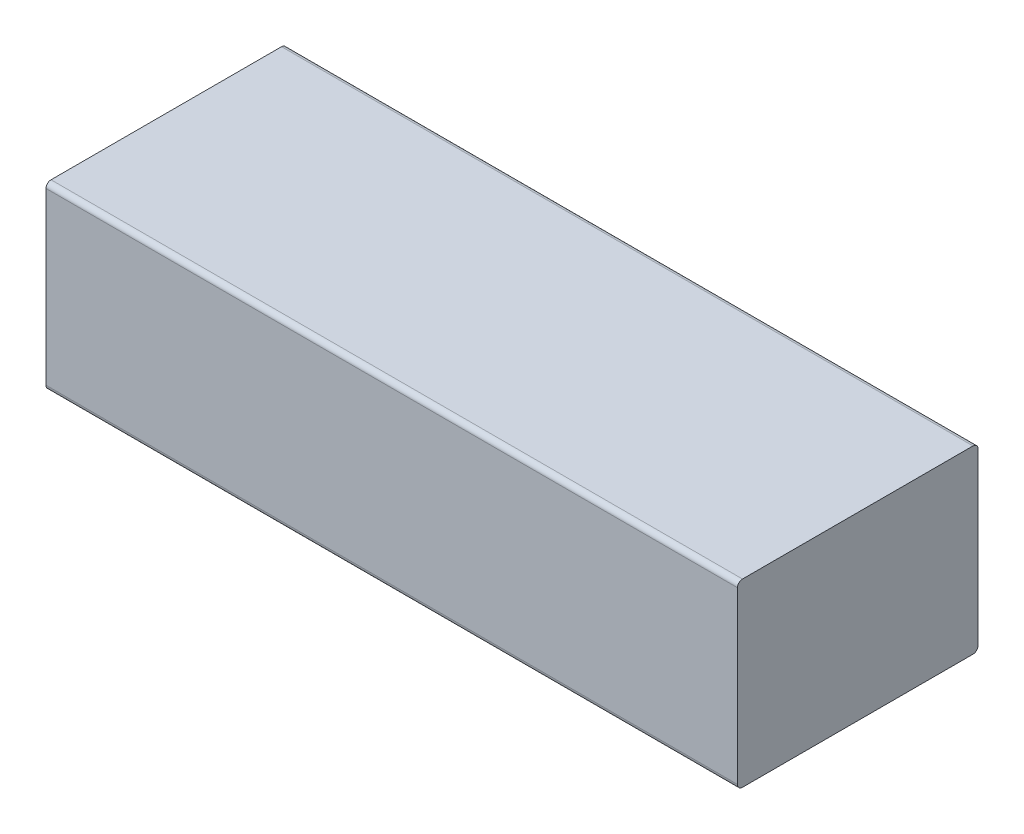
ISO-10303-21;
HEADER;
FILE_DESCRIPTION(('STEP AP214'),'2;1');
FILE_NAME('part.step','',(''),(''),'','','');
FILE_SCHEMA(('AUTOMOTIVE_DESIGN { 1 0 10303 214 1 1 1 1 }'));
ENDSEC;
DATA;
#1=APPLICATION_CONTEXT('core data for automotive mechanical design processes');
#2=APPLICATION_PROTOCOL_DEFINITION('international standard','automotive_design',2000,#1);
#3=PRODUCT_CONTEXT('',#1,'mechanical');
#4=PRODUCT('Part','Part','',(#3));
#5=PRODUCT_RELATED_PRODUCT_CATEGORY('part','',(#4));
#6=PRODUCT_DEFINITION_FORMATION('','',#4);
#7=PRODUCT_DEFINITION_CONTEXT('part definition',#1,'design');
#8=PRODUCT_DEFINITION('design','',#6,#7);
#9=PRODUCT_DEFINITION_SHAPE('','',#8);
#10=(LENGTH_UNIT() NAMED_UNIT(*) SI_UNIT(.MILLI.,.METRE.));
#11=(NAMED_UNIT(*) PLANE_ANGLE_UNIT() SI_UNIT($,.RADIAN.));
#12=(NAMED_UNIT(*) SI_UNIT($,.STERADIAN.) SOLID_ANGLE_UNIT());
#13=UNCERTAINTY_MEASURE_WITH_UNIT(LENGTH_MEASURE(1.E-05),#10,'distance_accuracy_value','');
#14=(GEOMETRIC_REPRESENTATION_CONTEXT(3) GLOBAL_UNCERTAINTY_ASSIGNED_CONTEXT((#13)) GLOBAL_UNIT_ASSIGNED_CONTEXT((#10,
#11,#12)) REPRESENTATION_CONTEXT('',''));
#15=CARTESIAN_POINT('',(0.,0.,0.));
#16=DIRECTION('',(0.,0.,1.));
#17=DIRECTION('',(1.,0.,0.));
#18=AXIS2_PLACEMENT_3D('',#15,#16,#17);
#19=CARTESIAN_POINT('',(0.,0.,-48.));
#20=DIRECTION('',(-1.,0.,0.));
#21=DIRECTION('',(0.,0.,1.));
#22=AXIS2_PLACEMENT_3D('',#19,#20,#21);
#23=PLANE('',#22);
#24=DIRECTION('',(0.,-1.,0.));
#25=VECTOR('',#24,1.);
#26=CARTESIAN_POINT('',(0.,4.,-3.37357315779463));
#27=LINE('',#26,#25);
#28=CARTESIAN_POINT('',(0.,4.,-3.37357315779463));
#29=VERTEX_POINT('',#28);
#30=CARTESIAN_POINT('',(0.,0.,-3.37357315779463));
#31=VERTEX_POINT('',#30);
#32=EDGE_CURVE('E170',#29,#31,#27,.T.);
#33=ORIENTED_EDGE('',*,*,#32,.T.);
#34=DIRECTION('',(0.,0.,1.));
#35=VECTOR('',#34,1.);
#36=CARTESIAN_POINT('',(0.,0.,-48.));
#37=LINE('',#36,#35);
#38=CARTESIAN_POINT('',(0.,0.,-1.));
#39=VERTEX_POINT('',#38);
#40=EDGE_CURVE('E166',#31,#39,#37,.T.);
#41=ORIENTED_EDGE('',*,*,#40,.T.);
#42=CARTESIAN_POINT('',(0.,1.,-1.));
#43=DIRECTION('',(-1.,0.,0.));
#44=DIRECTION('',(0.,0.,1.));
#45=AXIS2_PLACEMENT_3D('',#42,#43,#44);
#46=CIRCLE('',#45,1.);
#47=CARTESIAN_POINT('',(0.,1.,0.));
#48=VERTEX_POINT('',#47);
#49=EDGE_CURVE('E203',#39,#48,#46,.T.);
#50=ORIENTED_EDGE('',*,*,#49,.T.);
#51=DIRECTION('',(0.,-1.,0.));
#52=VECTOR('',#51,1.);
#53=CARTESIAN_POINT('',(0.,0.,0.));
#54=LINE('',#53,#52);
#55=CARTESIAN_POINT('',(0.,35.,0.));
#56=VERTEX_POINT('',#55);
#57=EDGE_CURVE('E167',#56,#48,#54,.T.);
#58=ORIENTED_EDGE('',*,*,#57,.F.);
#59=CARTESIAN_POINT('',(0.,35.,-1.));
#60=DIRECTION('',(-1.,0.,0.));
#61=DIRECTION('',(0.,0.,1.));
#62=AXIS2_PLACEMENT_3D('',#59,#60,#61);
#63=CIRCLE('',#62,1.);
#64=CARTESIAN_POINT('',(0.,36.,-1.));
#65=VERTEX_POINT('',#64);
#66=EDGE_CURVE('E66',#56,#65,#63,.T.);
#67=ORIENTED_EDGE('',*,*,#66,.T.);
#68=DIRECTION('',(0.,0.,1.));
#69=VECTOR('',#68,1.);
#70=CARTESIAN_POINT('',(0.,36.,-48.));
#71=LINE('',#70,#69);
#72=CARTESIAN_POINT('',(0.,36.,-47.));
#73=VERTEX_POINT('',#72);
#74=EDGE_CURVE('E173',#73,#65,#71,.T.);
#75=ORIENTED_EDGE('',*,*,#74,.F.);
#76=CARTESIAN_POINT('',(0.,35.,-47.));
#77=DIRECTION('',(-1.,0.,0.));
#78=DIRECTION('',(0.,0.,1.));
#79=AXIS2_PLACEMENT_3D('',#76,#77,#78);
#80=CIRCLE('',#79,1.);
#81=CARTESIAN_POINT('',(0.,35.,-48.));
#82=VERTEX_POINT('',#81);
#83=EDGE_CURVE('E201',#73,#82,#80,.T.);
#84=ORIENTED_EDGE('',*,*,#83,.T.);
#85=DIRECTION('',(0.,-1.,0.));
#86=VECTOR('',#85,1.);
#87=CARTESIAN_POINT('',(0.,0.,-48.));
#88=LINE('',#87,#86);
#89=CARTESIAN_POINT('',(0.,1.,-48.));
#90=VERTEX_POINT('',#89);
#91=EDGE_CURVE('E159',#82,#90,#88,.T.);
#92=ORIENTED_EDGE('',*,*,#91,.T.);
#93=CARTESIAN_POINT('',(0.,1.,-47.));
#94=DIRECTION('',(-1.,0.,0.));
#95=DIRECTION('',(0.,0.,1.));
#96=AXIS2_PLACEMENT_3D('',#93,#94,#95);
#97=CIRCLE('',#96,1.);
#98=CARTESIAN_POINT('',(0.,0.,-47.));
#99=VERTEX_POINT('',#98);
#100=EDGE_CURVE('E205',#90,#99,#97,.T.);
#101=ORIENTED_EDGE('',*,*,#100,.T.);
#102=CARTESIAN_POINT('',(0.,0.,-13.1008128877053));
#103=VERTEX_POINT('',#102);
#104=EDGE_CURVE('E152',#99,#103,#37,.T.);
#105=ORIENTED_EDGE('',*,*,#104,.T.);
#106=DIRECTION('',(0.,-1.,0.));
#107=VECTOR('',#106,1.);
#108=CARTESIAN_POINT('',(0.,4.,-13.1008128877053));
#109=LINE('',#108,#107);
#110=CARTESIAN_POINT('',(0.,4.,-13.1008128877053));
#111=VERTEX_POINT('',#110);
#112=EDGE_CURVE('E58',#111,#103,#109,.T.);
#113=ORIENTED_EDGE('',*,*,#112,.F.);
#114=DIRECTION('',(0.,0.,-1.));
#115=VECTOR('',#114,1.);
#116=CARTESIAN_POINT('',(0.,4.,-3.37357315779463));
#117=LINE('',#116,#115);
#118=EDGE_CURVE('E140',#29,#111,#117,.T.);
#119=ORIENTED_EDGE('',*,*,#118,.F.);
#120=EDGE_LOOP('',(#33,#41,#50,#58,#67,#75,#84,#92,#101,#105,#113,#119));
#121=FACE_BOUND('',#120,.T.);
#122=ADVANCED_FACE('F43',(#121),#23,.T.);
#123=CARTESIAN_POINT('',(0.,36.,-48.));
#124=DIRECTION('',(0.,1.,0.));
#125=DIRECTION('',(0.,0.,1.));
#126=AXIS2_PLACEMENT_3D('',#123,#124,#125);
#127=PLANE('',#126);
#128=DIRECTION('',(0.,0.,1.));
#129=VECTOR('',#128,1.);
#130=CARTESIAN_POINT('',(138.,36.,-48.));
#131=LINE('',#130,#129);
#132=CARTESIAN_POINT('',(138.,36.,-47.));
#133=VERTEX_POINT('',#132);
#134=CARTESIAN_POINT('',(138.,36.,-1.));
#135=VERTEX_POINT('',#134);
#136=EDGE_CURVE('E176',#133,#135,#131,.T.);
#137=ORIENTED_EDGE('',*,*,#136,.F.);
#138=DIRECTION('',(-1.,0.,0.));
#139=VECTOR('',#138,1.);
#140=CARTESIAN_POINT('',(0.,36.,-47.));
#141=LINE('',#140,#139);
#142=EDGE_CURVE('E11',#133,#73,#141,.T.);
#143=ORIENTED_EDGE('',*,*,#142,.T.);
#144=ORIENTED_EDGE('',*,*,#74,.T.);
#145=DIRECTION('',(-1.,0.,0.));
#146=VECTOR('',#145,1.);
#147=CARTESIAN_POINT('',(138.,36.,-1.));
#148=LINE('',#147,#146);
#149=EDGE_CURVE('E51',#65,#135,#148,.F.);
#150=ORIENTED_EDGE('',*,*,#149,.T.);
#151=EDGE_LOOP('',(#137,#143,#144,#150));
#152=FACE_BOUND('',#151,.T.);
#153=ADVANCED_FACE('F215',(#152),#127,.T.);
#154=CARTESIAN_POINT('',(138.,0.,-48.));
#155=DIRECTION('',(1.,0.,0.));
#156=DIRECTION('',(0.,0.,-1.));
#157=AXIS2_PLACEMENT_3D('',#154,#155,#156);
#158=PLANE('',#157);
#159=DIRECTION('',(0.,0.,1.));
#160=VECTOR('',#159,1.);
#161=CARTESIAN_POINT('',(138.,0.,-48.));
#162=LINE('',#161,#160);
#163=CARTESIAN_POINT('',(138.,0.,-47.));
#164=VERTEX_POINT('',#163);
#165=CARTESIAN_POINT('',(138.,0.,-1.));
#166=VERTEX_POINT('',#165);
#167=EDGE_CURVE('E179',#164,#166,#162,.T.);
#168=ORIENTED_EDGE('',*,*,#167,.F.);
#169=CARTESIAN_POINT('',(138.,1.,-47.));
#170=DIRECTION('',(1.,0.,0.));
#171=DIRECTION('',(0.,0.,-1.));
#172=AXIS2_PLACEMENT_3D('',#169,#170,#171);
#173=CIRCLE('',#172,1.);
#174=CARTESIAN_POINT('',(138.,1.,-48.));
#175=VERTEX_POINT('',#174);
#176=EDGE_CURVE('E194',#164,#175,#173,.T.);
#177=ORIENTED_EDGE('',*,*,#176,.T.);
#178=DIRECTION('',(0.,1.,0.));
#179=VECTOR('',#178,1.);
#180=CARTESIAN_POINT('',(138.,0.,-48.));
#181=LINE('',#180,#179);
#182=CARTESIAN_POINT('',(138.,35.,-48.));
#183=VERTEX_POINT('',#182);
#184=EDGE_CURVE('E162',#175,#183,#181,.T.);
#185=ORIENTED_EDGE('',*,*,#184,.T.);
#186=CARTESIAN_POINT('',(138.,35.,-47.));
#187=DIRECTION('',(1.,0.,0.));
#188=DIRECTION('',(0.,0.,-1.));
#189=AXIS2_PLACEMENT_3D('',#186,#187,#188);
#190=CIRCLE('',#189,1.);
#191=EDGE_CURVE('E190',#183,#133,#190,.T.);
#192=ORIENTED_EDGE('',*,*,#191,.T.);
#193=ORIENTED_EDGE('',*,*,#136,.T.);
#194=CARTESIAN_POINT('',(138.,35.,-1.));
#195=DIRECTION('',(1.,0.,0.));
#196=DIRECTION('',(0.,0.,-1.));
#197=AXIS2_PLACEMENT_3D('',#194,#195,#196);
#198=CIRCLE('',#197,1.);
#199=CARTESIAN_POINT('',(138.,35.,0.));
#200=VERTEX_POINT('',#199);
#201=EDGE_CURVE('E188',#135,#200,#198,.T.);
#202=ORIENTED_EDGE('',*,*,#201,.T.);
#203=DIRECTION('',(0.,1.,0.));
#204=VECTOR('',#203,1.);
#205=CARTESIAN_POINT('',(138.,0.,0.));
#206=LINE('',#205,#204);
#207=CARTESIAN_POINT('',(138.,1.,0.));
#208=VERTEX_POINT('',#207);
#209=EDGE_CURVE('E163',#208,#200,#206,.T.);
#210=ORIENTED_EDGE('',*,*,#209,.F.);
#211=CARTESIAN_POINT('',(138.,1.,-1.));
#212=DIRECTION('',(1.,0.,0.));
#213=DIRECTION('',(0.,0.,-1.));
#214=AXIS2_PLACEMENT_3D('',#211,#212,#213);
#215=CIRCLE('',#214,1.);
#216=EDGE_CURVE('E192',#208,#166,#215,.T.);
#217=ORIENTED_EDGE('',*,*,#216,.T.);
#218=EDGE_LOOP('',(#168,#177,#185,#192,#193,#202,#210,#217));
#219=FACE_BOUND('',#218,.T.);
#220=ADVANCED_FACE('F221',(#219),#158,.T.);
#221=CARTESIAN_POINT('',(0.,0.,-48.));
#222=DIRECTION('',(0.,-1.,0.));
#223=DIRECTION('',(0.,0.,-1.));
#224=AXIS2_PLACEMENT_3D('',#221,#222,#223);
#225=PLANE('',#224);
#226=DIRECTION('',(-1.,0.,0.));
#227=VECTOR('',#226,1.);
#228=CARTESIAN_POINT('',(0.,0.,-3.37357315779463));
#229=LINE('',#228,#227);
#230=CARTESIAN_POINT('',(5.12111463749805,0.,-3.37357315779463));
#231=VERTEX_POINT('',#230);
#232=EDGE_CURVE('E148',#231,#31,#229,.T.);
#233=ORIENTED_EDGE('',*,*,#232,.F.);
#234=DIRECTION('',(0.,0.,1.));
#235=VECTOR('',#234,1.);
#236=CARTESIAN_POINT('',(5.12111463749805,0.,-3.37357315779463));
#237=LINE('',#236,#235);
#238=CARTESIAN_POINT('',(5.12111463749805,0.,-13.1008128877053));
#239=VERTEX_POINT('',#238);
#240=EDGE_CURVE('E364',#239,#231,#237,.T.);
#241=ORIENTED_EDGE('',*,*,#240,.F.);
#242=DIRECTION('',(1.,0.,0.));
#243=VECTOR('',#242,1.);
#244=CARTESIAN_POINT('',(0.,0.,-13.1008128877053));
#245=LINE('',#244,#243);
#246=EDGE_CURVE('E365',#103,#239,#245,.T.);
#247=ORIENTED_EDGE('',*,*,#246,.F.);
#248=ORIENTED_EDGE('',*,*,#104,.F.);
#249=DIRECTION('',(1.,0.,0.));
#250=VECTOR('',#249,1.);
#251=CARTESIAN_POINT('',(0.,0.,-47.));
#252=LINE('',#251,#250);
#253=EDGE_CURVE('E185',#99,#164,#252,.T.);
#254=ORIENTED_EDGE('',*,*,#253,.T.);
#255=ORIENTED_EDGE('',*,*,#167,.T.);
#256=DIRECTION('',(1.,0.,0.));
#257=VECTOR('',#256,1.);
#258=CARTESIAN_POINT('',(0.,0.,-1.));
#259=LINE('',#258,#257);
#260=EDGE_CURVE('E175',#166,#39,#259,.F.);
#261=ORIENTED_EDGE('',*,*,#260,.T.);
#262=ORIENTED_EDGE('',*,*,#40,.F.);
#263=EDGE_LOOP('',(#233,#241,#247,#248,#254,#255,#261,#262));
#264=FACE_BOUND('',#263,.T.);
#265=ADVANCED_FACE('F235',(#264),#225,.T.);
#266=CARTESIAN_POINT('',(0.,0.,-48.));
#267=DIRECTION('',(0.,0.,-1.));
#268=DIRECTION('',(-1.,0.,0.));
#269=AXIS2_PLACEMENT_3D('',#266,#267,#268);
#270=PLANE('',#269);
#271=ORIENTED_EDGE('',*,*,#184,.F.);
#272=DIRECTION('',(1.,0.,0.));
#273=VECTOR('',#272,1.);
#274=CARTESIAN_POINT('',(0.,1.,-48.));
#275=LINE('',#274,#273);
#276=EDGE_CURVE('E198',#175,#90,#275,.F.);
#277=ORIENTED_EDGE('',*,*,#276,.T.);
#278=ORIENTED_EDGE('',*,*,#91,.F.);
#279=DIRECTION('',(-1.,0.,0.));
#280=VECTOR('',#279,1.);
#281=CARTESIAN_POINT('',(0.,35.,-48.));
#282=LINE('',#281,#280);
#283=EDGE_CURVE('E196',#82,#183,#282,.F.);
#284=ORIENTED_EDGE('',*,*,#283,.T.);
#285=EDGE_LOOP('',(#271,#277,#278,#284));
#286=FACE_BOUND('',#285,.T.);
#287=ADVANCED_FACE('F243',(#286),#270,.T.);
#288=CARTESIAN_POINT('',(0.,0.,0.));
#289=DIRECTION('',(0.,0.,-1.));
#290=DIRECTION('',(-1.,0.,0.));
#291=AXIS2_PLACEMENT_3D('',#288,#289,#290);
#292=PLANE('',#291);
#293=ORIENTED_EDGE('',*,*,#57,.T.);
#294=DIRECTION('',(1.,0.,0.));
#295=VECTOR('',#294,1.);
#296=CARTESIAN_POINT('',(138.,1.,0.));
#297=LINE('',#296,#295);
#298=EDGE_CURVE('E210',#48,#208,#297,.T.);
#299=ORIENTED_EDGE('',*,*,#298,.T.);
#300=ORIENTED_EDGE('',*,*,#209,.T.);
#301=DIRECTION('',(-1.,0.,0.));
#302=VECTOR('',#301,1.);
#303=CARTESIAN_POINT('',(0.,35.,0.));
#304=LINE('',#303,#302);
#305=EDGE_CURVE('E207',#200,#56,#304,.T.);
#306=ORIENTED_EDGE('',*,*,#305,.T.);
#307=EDGE_LOOP('',(#293,#299,#300,#306));
#308=FACE_BOUND('',#307,.T.);
#309=ADVANCED_FACE('F226',(#308),#292,.F.);
#310=CARTESIAN_POINT('',(0.,1.,-47.));
#311=DIRECTION('',(1.,0.,0.));
#312=DIRECTION('',(0.,0.,-1.));
#313=AXIS2_PLACEMENT_3D('',#310,#311,#312);
#314=CYLINDRICAL_SURFACE('',#313,1.);
#315=ORIENTED_EDGE('',*,*,#100,.F.);
#316=ORIENTED_EDGE('',*,*,#276,.F.);
#317=ORIENTED_EDGE('',*,*,#176,.F.);
#318=ORIENTED_EDGE('',*,*,#253,.F.);
#319=EDGE_LOOP('',(#315,#316,#317,#318));
#320=FACE_BOUND('',#319,.T.);
#321=ADVANCED_FACE('F239',(#320),#314,.T.);
#322=CARTESIAN_POINT('',(0.,1.,-1.));
#323=DIRECTION('',(-1.,0.,0.));
#324=DIRECTION('',(0.,0.,1.));
#325=AXIS2_PLACEMENT_3D('',#322,#323,#324);
#326=CYLINDRICAL_SURFACE('',#325,1.);
#327=ORIENTED_EDGE('',*,*,#49,.F.);
#328=ORIENTED_EDGE('',*,*,#260,.F.);
#329=ORIENTED_EDGE('',*,*,#216,.F.);
#330=ORIENTED_EDGE('',*,*,#298,.F.);
#331=EDGE_LOOP('',(#327,#328,#329,#330));
#332=FACE_BOUND('',#331,.T.);
#333=ADVANCED_FACE('F232',(#332),#326,.T.);
#334=CARTESIAN_POINT('',(0.,35.,-47.));
#335=DIRECTION('',(-1.,0.,0.));
#336=DIRECTION('',(0.,0.,1.));
#337=AXIS2_PLACEMENT_3D('',#334,#335,#336);
#338=CYLINDRICAL_SURFACE('',#337,1.);
#339=ORIENTED_EDGE('',*,*,#191,.F.);
#340=ORIENTED_EDGE('',*,*,#283,.F.);
#341=ORIENTED_EDGE('',*,*,#83,.F.);
#342=ORIENTED_EDGE('',*,*,#142,.F.);
#343=EDGE_LOOP('',(#339,#340,#341,#342));
#344=FACE_BOUND('',#343,.T.);
#345=ADVANCED_FACE('F247',(#344),#338,.T.);
#346=CARTESIAN_POINT('',(0.,35.,-1.));
#347=DIRECTION('',(1.,0.,0.));
#348=DIRECTION('',(0.,0.,-1.));
#349=AXIS2_PLACEMENT_3D('',#346,#347,#348);
#350=CYLINDRICAL_SURFACE('',#349,1.);
#351=ORIENTED_EDGE('',*,*,#201,.F.);
#352=ORIENTED_EDGE('',*,*,#149,.F.);
#353=ORIENTED_EDGE('',*,*,#66,.F.);
#354=ORIENTED_EDGE('',*,*,#305,.F.);
#355=EDGE_LOOP('',(#351,#352,#353,#354));
#356=FACE_BOUND('',#355,.T.);
#357=ADVANCED_FACE('F45',(#356),#350,.T.);
#358=CARTESIAN_POINT('',(0.,4.,-3.37357315779463));
#359=DIRECTION('',(0.,0.,1.));
#360=DIRECTION('',(1.,0.,0.));
#361=AXIS2_PLACEMENT_3D('',#358,#359,#360);
#362=PLANE('',#361);
#363=ORIENTED_EDGE('',*,*,#232,.T.);
#364=ORIENTED_EDGE('',*,*,#32,.F.);
#365=DIRECTION('',(-1.,0.,0.));
#366=VECTOR('',#365,1.);
#367=CARTESIAN_POINT('',(0.,4.,-3.37357315779463));
#368=LINE('',#367,#366);
#369=CARTESIAN_POINT('',(5.12111463749805,4.,-3.37357315779463));
#370=VERTEX_POINT('',#369);
#371=EDGE_CURVE('E146',#370,#29,#368,.T.);
#372=ORIENTED_EDGE('',*,*,#371,.F.);
#373=DIRECTION('',(0.,-1.,0.));
#374=VECTOR('',#373,1.);
#375=CARTESIAN_POINT('',(5.12111463749805,4.,-3.37357315779463));
#376=LINE('',#375,#374);
#377=EDGE_CURVE('E154',#370,#231,#376,.T.);
#378=ORIENTED_EDGE('',*,*,#377,.T.);
#379=EDGE_LOOP('',(#363,#364,#372,#378));
#380=FACE_BOUND('',#379,.T.);
#381=ADVANCED_FACE('F253',(#380),#362,.F.);
#382=CARTESIAN_POINT('',(5.12111463749805,4.,-3.37357315779463));
#383=DIRECTION('',(1.,0.,0.));
#384=DIRECTION('',(0.,0.,-1.));
#385=AXIS2_PLACEMENT_3D('',#382,#383,#384);
#386=PLANE('',#385);
#387=ORIENTED_EDGE('',*,*,#240,.T.);
#388=ORIENTED_EDGE('',*,*,#377,.F.);
#389=DIRECTION('',(0.,0.,1.));
#390=VECTOR('',#389,1.);
#391=CARTESIAN_POINT('',(5.12111463749805,4.,-3.37357315779463));
#392=LINE('',#391,#390);
#393=CARTESIAN_POINT('',(5.12111463749805,4.,-13.1008128877053));
#394=VERTEX_POINT('',#393);
#395=EDGE_CURVE('E139',#394,#370,#392,.T.);
#396=ORIENTED_EDGE('',*,*,#395,.F.);
#397=DIRECTION('',(0.,-1.,0.));
#398=VECTOR('',#397,1.);
#399=CARTESIAN_POINT('',(5.12111463749805,4.,-13.1008128877053));
#400=LINE('',#399,#398);
#401=EDGE_CURVE('E135',#394,#239,#400,.T.);
#402=ORIENTED_EDGE('',*,*,#401,.T.);
#403=EDGE_LOOP('',(#387,#388,#396,#402));
#404=FACE_BOUND('',#403,.T.);
#405=ADVANCED_FACE('F288',(#404),#386,.F.);
#406=CARTESIAN_POINT('',(0.,4.,-13.1008128877053));
#407=DIRECTION('',(0.,0.,-1.));
#408=DIRECTION('',(-1.,0.,0.));
#409=AXIS2_PLACEMENT_3D('',#406,#407,#408);
#410=PLANE('',#409);
#411=ORIENTED_EDGE('',*,*,#246,.T.);
#412=ORIENTED_EDGE('',*,*,#401,.F.);
#413=DIRECTION('',(1.,0.,0.));
#414=VECTOR('',#413,1.);
#415=CARTESIAN_POINT('',(0.,4.,-13.1008128877053));
#416=LINE('',#415,#414);
#417=EDGE_CURVE('E132',#111,#394,#416,.T.);
#418=ORIENTED_EDGE('',*,*,#417,.F.);
#419=ORIENTED_EDGE('',*,*,#112,.T.);
#420=EDGE_LOOP('',(#411,#412,#418,#419));
#421=FACE_BOUND('',#420,.T.);
#422=ADVANCED_FACE('F134',(#421),#410,.F.);
#423=CARTESIAN_POINT('',(0.,4.,0.));
#424=DIRECTION('',(0.,-1.,0.));
#425=DIRECTION('',(0.,0.,-1.));
#426=AXIS2_PLACEMENT_3D('',#423,#424,#425);
#427=PLANE('',#426);
#428=ORIENTED_EDGE('',*,*,#118,.T.);
#429=ORIENTED_EDGE('',*,*,#417,.T.);
#430=ORIENTED_EDGE('',*,*,#395,.T.);
#431=ORIENTED_EDGE('',*,*,#371,.T.);
#432=EDGE_LOOP('',(#428,#429,#430,#431));
#433=FACE_BOUND('',#432,.T.);
#434=ADVANCED_FACE('F144',(#433),#427,.T.);
#435=CLOSED_SHELL('',(#122,#153,#220,#265,#287,#309,#321,#333,#345,#357,#381,#405,#422,#434));
#436=MANIFOLD_SOLID_BREP('B2',#435);
#437=ADVANCED_BREP_SHAPE_REPRESENTATION('',(#18,#436),#14);
#438=SHAPE_DEFINITION_REPRESENTATION(#9,#437);
ENDSEC;
END-ISO-10303-21;
